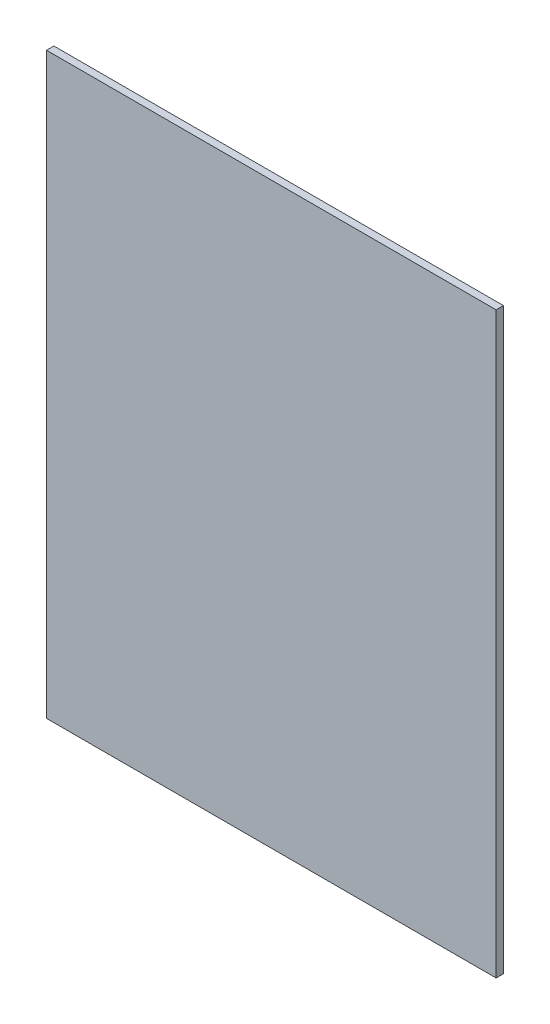
ISO-10303-21;
HEADER;
FILE_DESCRIPTION(('STEP AP214'),'2;1');
FILE_NAME('part.step','',(''),(''),'','','');
FILE_SCHEMA(('AUTOMOTIVE_DESIGN { 1 0 10303 214 1 1 1 1 }'));
ENDSEC;
DATA;
#1=APPLICATION_CONTEXT('core data for automotive mechanical design processes');
#2=APPLICATION_PROTOCOL_DEFINITION('international standard','automotive_design',2000,#1);
#3=PRODUCT_CONTEXT('',#1,'mechanical');
#4=PRODUCT('Part','Part','',(#3));
#5=PRODUCT_RELATED_PRODUCT_CATEGORY('part','',(#4));
#6=PRODUCT_DEFINITION_FORMATION('','',#4);
#7=PRODUCT_DEFINITION_CONTEXT('part definition',#1,'design');
#8=PRODUCT_DEFINITION('design','',#6,#7);
#9=PRODUCT_DEFINITION_SHAPE('','',#8);
#10=(LENGTH_UNIT() NAMED_UNIT(*) SI_UNIT(.MILLI.,.METRE.));
#11=(NAMED_UNIT(*) PLANE_ANGLE_UNIT() SI_UNIT($,.RADIAN.));
#12=(NAMED_UNIT(*) SI_UNIT($,.STERADIAN.) SOLID_ANGLE_UNIT());
#13=UNCERTAINTY_MEASURE_WITH_UNIT(LENGTH_MEASURE(1.E-05),#10,'distance_accuracy_value','');
#14=(GEOMETRIC_REPRESENTATION_CONTEXT(3) GLOBAL_UNCERTAINTY_ASSIGNED_CONTEXT((#13)) GLOBAL_UNIT_ASSIGNED_CONTEXT((#10,
#11,#12)) REPRESENTATION_CONTEXT('',''));
#15=CARTESIAN_POINT('',(0.,0.,0.));
#16=DIRECTION('',(0.,0.,1.));
#17=DIRECTION('',(1.,0.,0.));
#18=AXIS2_PLACEMENT_3D('',#15,#16,#17);
#19=CARTESIAN_POINT('',(0.,0.,11.938));
#20=DIRECTION('',(-1.,0.,0.));
#21=DIRECTION('',(0.,0.,1.));
#22=AXIS2_PLACEMENT_3D('',#19,#20,#21);
#23=PLANE('',#22);
#24=DIRECTION('',(0.,1.,0.));
#25=VECTOR('',#24,1.);
#26=CARTESIAN_POINT('',(0.,0.,0.));
#27=LINE('',#26,#25);
#28=CARTESIAN_POINT('',(0.,0.,0.));
#29=VERTEX_POINT('',#28);
#30=CARTESIAN_POINT('',(0.,939.8,0.));
#31=VERTEX_POINT('',#30);
#32=EDGE_CURVE('E107',#29,#31,#27,.T.);
#33=ORIENTED_EDGE('',*,*,#32,.T.);
#34=DIRECTION('',(0.,0.,-1.));
#35=VECTOR('',#34,1.);
#36=CARTESIAN_POINT('',(0.,939.8,11.938));
#37=LINE('',#36,#35);
#38=CARTESIAN_POINT('',(0.,939.8,11.938));
#39=VERTEX_POINT('',#38);
#40=EDGE_CURVE('E11',#39,#31,#37,.T.);
#41=ORIENTED_EDGE('',*,*,#40,.F.);
#42=DIRECTION('',(0.,1.,0.));
#43=VECTOR('',#42,1.);
#44=CARTESIAN_POINT('',(0.,0.,11.938));
#45=LINE('',#44,#43);
#46=CARTESIAN_POINT('',(0.,0.,11.938));
#47=VERTEX_POINT('',#46);
#48=EDGE_CURVE('E91',#47,#39,#45,.T.);
#49=ORIENTED_EDGE('',*,*,#48,.F.);
#50=DIRECTION('',(0.,0.,-1.));
#51=VECTOR('',#50,1.);
#52=CARTESIAN_POINT('',(0.,0.,11.938));
#53=LINE('',#52,#51);
#54=EDGE_CURVE('E103',#47,#29,#53,.T.);
#55=ORIENTED_EDGE('',*,*,#54,.T.);
#56=EDGE_LOOP('',(#33,#41,#49,#55));
#57=FACE_BOUND('',#56,.T.);
#58=ADVANCED_FACE('F39',(#57),#23,.F.);
#59=CARTESIAN_POINT('',(0.,939.8,11.938));
#60=DIRECTION('',(0.,-1.,0.));
#61=DIRECTION('',(1.,0.,0.));
#62=AXIS2_PLACEMENT_3D('',#59,#60,#61);
#63=PLANE('',#62);
#64=DIRECTION('',(-1.,0.,0.));
#65=VECTOR('',#64,1.);
#66=CARTESIAN_POINT('',(0.,939.8,0.));
#67=LINE('',#66,#65);
#68=CARTESIAN_POINT('',(-730.25,939.8,0.));
#69=VERTEX_POINT('',#68);
#70=EDGE_CURVE('E96',#31,#69,#67,.T.);
#71=ORIENTED_EDGE('',*,*,#70,.T.);
#72=DIRECTION('',(0.,0.,-1.));
#73=VECTOR('',#72,1.);
#74=CARTESIAN_POINT('',(-730.25,939.8,11.938));
#75=LINE('',#74,#73);
#76=CARTESIAN_POINT('',(-730.25,939.8,11.938));
#77=VERTEX_POINT('',#76);
#78=EDGE_CURVE('E48',#77,#69,#75,.T.);
#79=ORIENTED_EDGE('',*,*,#78,.F.);
#80=DIRECTION('',(-1.,0.,0.));
#81=VECTOR('',#80,1.);
#82=CARTESIAN_POINT('',(0.,939.8,11.938));
#83=LINE('',#82,#81);
#84=EDGE_CURVE('E86',#39,#77,#83,.T.);
#85=ORIENTED_EDGE('',*,*,#84,.F.);
#86=ORIENTED_EDGE('',*,*,#40,.T.);
#87=EDGE_LOOP('',(#71,#79,#85,#86));
#88=FACE_BOUND('',#87,.T.);
#89=ADVANCED_FACE('F95',(#88),#63,.F.);
#90=CARTESIAN_POINT('',(-730.25,0.,11.938));
#91=DIRECTION('',(1.,0.,0.));
#92=DIRECTION('',(0.,1.,0.));
#93=AXIS2_PLACEMENT_3D('',#90,#91,#92);
#94=PLANE('',#93);
#95=DIRECTION('',(0.,-1.,0.));
#96=VECTOR('',#95,1.);
#97=CARTESIAN_POINT('',(-730.25,0.,0.));
#98=LINE('',#97,#96);
#99=CARTESIAN_POINT('',(-730.25,0.,0.));
#100=VERTEX_POINT('',#99);
#101=EDGE_CURVE('E73',#69,#100,#98,.T.);
#102=ORIENTED_EDGE('',*,*,#101,.T.);
#103=DIRECTION('',(0.,0.,-1.));
#104=VECTOR('',#103,1.);
#105=CARTESIAN_POINT('',(-730.25,0.,11.938));
#106=LINE('',#105,#104);
#107=CARTESIAN_POINT('',(-730.25,0.,11.938));
#108=VERTEX_POINT('',#107);
#109=EDGE_CURVE('E98',#108,#100,#106,.T.);
#110=ORIENTED_EDGE('',*,*,#109,.F.);
#111=DIRECTION('',(0.,-1.,0.));
#112=VECTOR('',#111,1.);
#113=CARTESIAN_POINT('',(-730.25,0.,11.938));
#114=LINE('',#113,#112);
#115=EDGE_CURVE('E89',#77,#108,#114,.T.);
#116=ORIENTED_EDGE('',*,*,#115,.F.);
#117=ORIENTED_EDGE('',*,*,#78,.T.);
#118=EDGE_LOOP('',(#102,#110,#116,#117));
#119=FACE_BOUND('',#118,.T.);
#120=ADVANCED_FACE('F99',(#119),#94,.F.);
#121=CARTESIAN_POINT('',(0.,0.,11.938));
#122=DIRECTION('',(0.,1.,0.));
#123=DIRECTION('',(0.,0.,1.));
#124=AXIS2_PLACEMENT_3D('',#121,#122,#123);
#125=PLANE('',#124);
#126=DIRECTION('',(1.,0.,0.));
#127=VECTOR('',#126,1.);
#128=CARTESIAN_POINT('',(0.,0.,0.));
#129=LINE('',#128,#127);
#130=EDGE_CURVE('E79',#100,#29,#129,.T.);
#131=ORIENTED_EDGE('',*,*,#130,.T.);
#132=ORIENTED_EDGE('',*,*,#54,.F.);
#133=DIRECTION('',(1.,0.,0.));
#134=VECTOR('',#133,1.);
#135=CARTESIAN_POINT('',(0.,0.,11.938));
#136=LINE('',#135,#134);
#137=EDGE_CURVE('E56',#108,#47,#136,.T.);
#138=ORIENTED_EDGE('',*,*,#137,.F.);
#139=ORIENTED_EDGE('',*,*,#109,.T.);
#140=EDGE_LOOP('',(#131,#132,#138,#139));
#141=FACE_BOUND('',#140,.T.);
#142=ADVANCED_FACE('F120',(#141),#125,.F.);
#143=CARTESIAN_POINT('',(0.,0.,11.938));
#144=DIRECTION('',(0.,0.,1.));
#145=DIRECTION('',(1.,0.,0.));
#146=AXIS2_PLACEMENT_3D('',#143,#144,#145);
#147=PLANE('',#146);
#148=ORIENTED_EDGE('',*,*,#48,.T.);
#149=ORIENTED_EDGE('',*,*,#84,.T.);
#150=ORIENTED_EDGE('',*,*,#115,.T.);
#151=ORIENTED_EDGE('',*,*,#137,.T.);
#152=EDGE_LOOP('',(#148,#149,#150,#151));
#153=FACE_BOUND('',#152,.T.);
#154=ADVANCED_FACE('F87',(#153),#147,.T.);
#155=CARTESIAN_POINT('',(0.,0.,0.));
#156=DIRECTION('',(0.,0.,1.));
#157=DIRECTION('',(1.,0.,0.));
#158=AXIS2_PLACEMENT_3D('',#155,#156,#157);
#159=PLANE('',#158);
#160=ORIENTED_EDGE('',*,*,#32,.F.);
#161=ORIENTED_EDGE('',*,*,#130,.F.);
#162=ORIENTED_EDGE('',*,*,#101,.F.);
#163=ORIENTED_EDGE('',*,*,#70,.F.);
#164=EDGE_LOOP('',(#160,#161,#162,#163));
#165=FACE_BOUND('',#164,.T.);
#166=ADVANCED_FACE('F123',(#165),#159,.F.);
#167=CLOSED_SHELL('',(#58,#89,#120,#142,#154,#166));
#168=MANIFOLD_SOLID_BREP('B2',#167);
#169=ADVANCED_BREP_SHAPE_REPRESENTATION('',(#18,#168),#14);
#170=SHAPE_DEFINITION_REPRESENTATION(#9,#169);
ENDSEC;
END-ISO-10303-21;
